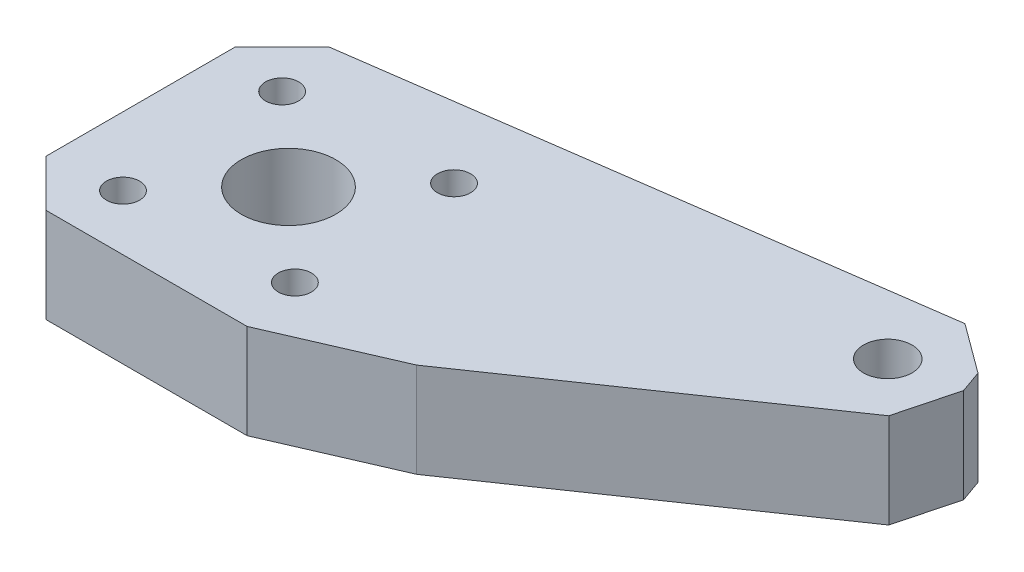
ISO-10303-21;
HEADER;
FILE_DESCRIPTION(('STEP AP214'),'2;1');
FILE_NAME('part.step','',(''),(''),'','','');
FILE_SCHEMA(('AUTOMOTIVE_DESIGN { 1 0 10303 214 1 1 1 1 }'));
ENDSEC;
DATA;
#1=APPLICATION_CONTEXT('core data for automotive mechanical design processes');
#2=APPLICATION_PROTOCOL_DEFINITION('international standard','automotive_design',2000,#1);
#3=PRODUCT_CONTEXT('',#1,'mechanical');
#4=PRODUCT('Part','Part','',(#3));
#5=PRODUCT_RELATED_PRODUCT_CATEGORY('part','',(#4));
#6=PRODUCT_DEFINITION_FORMATION('','',#4);
#7=PRODUCT_DEFINITION_CONTEXT('part definition',#1,'design');
#8=PRODUCT_DEFINITION('design','',#6,#7);
#9=PRODUCT_DEFINITION_SHAPE('','',#8);
#10=(LENGTH_UNIT() NAMED_UNIT(*) SI_UNIT(.MILLI.,.METRE.));
#11=(NAMED_UNIT(*) PLANE_ANGLE_UNIT() SI_UNIT($,.RADIAN.));
#12=(NAMED_UNIT(*) SI_UNIT($,.STERADIAN.) SOLID_ANGLE_UNIT());
#13=UNCERTAINTY_MEASURE_WITH_UNIT(LENGTH_MEASURE(1.E-05),#10,'distance_accuracy_value','');
#14=(GEOMETRIC_REPRESENTATION_CONTEXT(3) GLOBAL_UNCERTAINTY_ASSIGNED_CONTEXT((#13)) GLOBAL_UNIT_ASSIGNED_CONTEXT((#10,
#11,#12)) REPRESENTATION_CONTEXT('',''));
#15=CARTESIAN_POINT('',(0.,0.,0.));
#16=DIRECTION('',(0.,0.,1.));
#17=DIRECTION('',(1.,0.,0.));
#18=AXIS2_PLACEMENT_3D('',#15,#16,#17);
#19=CARTESIAN_POINT('',(0.,8.,0.));
#20=DIRECTION('',(0.,-1.,0.));
#21=DIRECTION('',(0.,0.,-1.));
#22=AXIS2_PLACEMENT_3D('',#19,#20,#21);
#23=PLANE('',#22);
#24=DIRECTION('',(1.,0.,0.));
#25=VECTOR('',#24,1.);
#26=CARTESIAN_POINT('',(17.,8.,-1.11355369369903E-13));
#27=LINE('',#26,#25);
#28=CARTESIAN_POINT('',(0.,8.,0.));
#29=VERTEX_POINT('',#28);
#30=CARTESIAN_POINT('',(17.,8.,-1.11355369369903E-13));
#31=VERTEX_POINT('',#30);
#32=EDGE_CURVE('E163',#29,#31,#27,.T.);
#33=ORIENTED_EDGE('',*,*,#32,.T.);
#34=DIRECTION('',(0.917339441335737,0.,-0.398105952442107));
#35=VECTOR('',#34,1.);
#36=CARTESIAN_POINT('',(26.9989999105595,8.,-4.33935488161908));
#37=LINE('',#36,#35);
#38=CARTESIAN_POINT('',(26.9989999105595,8.,-4.33935488161908));
#39=VERTEX_POINT('',#38);
#40=EDGE_CURVE('E101',#31,#39,#37,.T.);
#41=ORIENTED_EDGE('',*,*,#40,.T.);
#42=DIRECTION('',(0.824523135224951,0.,-0.565828242030049));
#43=VECTOR('',#42,1.);
#44=CARTESIAN_POINT('',(50.6628138915156,8.,-20.5786254278815));
#45=LINE('',#44,#43);
#46=CARTESIAN_POINT('',(50.6628138915156,8.,-20.5786254278815));
#47=VERTEX_POINT('',#46);
#48=EDGE_CURVE('E184',#39,#47,#45,.T.);
#49=ORIENTED_EDGE('',*,*,#48,.T.);
#50=DIRECTION('',(0.253603278088408,0.,-0.967308315555497));
#51=VECTOR('',#50,1.);
#52=CARTESIAN_POINT('',(51.9764788720136,8.,-25.589282502459));
#53=LINE('',#52,#51);
#54=CARTESIAN_POINT('',(51.9764788720136,8.,-25.589282502459));
#55=VERTEX_POINT('',#54);
#56=EDGE_CURVE('E203',#47,#55,#53,.T.);
#57=ORIENTED_EDGE('',*,*,#56,.T.);
#58=DIRECTION('',(-0.333558557625138,0.,-0.942729382503292));
#59=VECTOR('',#58,1.);
#60=CARTESIAN_POINT('',(51.3093617567633,8.,-27.4747412674656));
#61=LINE('',#60,#59);
#62=CARTESIAN_POINT('',(51.3093617567633,8.,-27.4747412674656));
#63=VERTEX_POINT('',#62);
#64=EDGE_CURVE('E200',#55,#63,#61,.T.);
#65=ORIENTED_EDGE('',*,*,#64,.T.);
#66=DIRECTION('',(-0.805521560746049,0.,-0.592566464772728));
#67=VECTOR('',#66,1.);
#68=CARTESIAN_POINT('',(47.1367600720988,8.,-30.5442355549883));
#69=LINE('',#68,#67);
#70=CARTESIAN_POINT('',(47.1367600720988,8.,-30.5442355549883));
#71=VERTEX_POINT('',#70);
#72=EDGE_CURVE('E202',#63,#71,#69,.T.);
#73=ORIENTED_EDGE('',*,*,#72,.T.);
#74=DIRECTION('',(-0.990268068741571,0.,0.139173100960062));
#75=VECTOR('',#74,1.);
#76=CARTESIAN_POINT('',(0.,8.,-23.9195959492893));
#77=LINE('',#76,#75);
#78=CARTESIAN_POINT('',(0.,8.,-23.9195959492893));
#79=VERTEX_POINT('',#78);
#80=EDGE_CURVE('E126',#71,#79,#77,.T.);
#81=ORIENTED_EDGE('',*,*,#80,.T.);
#82=DIRECTION('',(-0.707106781186548,0.,0.707106781186547));
#83=VECTOR('',#82,1.);
#84=CARTESIAN_POINT('',(-3.95979797464467,8.,-19.9597979746447));
#85=LINE('',#84,#83);
#86=CARTESIAN_POINT('',(-3.95979797464467,8.,-19.9597979746447));
#87=VERTEX_POINT('',#86);
#88=EDGE_CURVE('E120',#79,#87,#85,.T.);
#89=ORIENTED_EDGE('',*,*,#88,.T.);
#90=DIRECTION('',(0.,0.,1.));
#91=VECTOR('',#90,1.);
#92=CARTESIAN_POINT('',(-3.95979797464467,8.,-3.95979797464467));
#93=LINE('',#92,#91);
#94=CARTESIAN_POINT('',(-3.95979797464467,8.,-3.95979797464467));
#95=VERTEX_POINT('',#94);
#96=EDGE_CURVE('E124',#87,#95,#93,.T.);
#97=ORIENTED_EDGE('',*,*,#96,.T.);
#98=DIRECTION('',(0.707106781186547,0.,0.707106781186548));
#99=VECTOR('',#98,1.);
#100=CARTESIAN_POINT('',(0.,8.,0.));
#101=LINE('',#100,#99);
#102=EDGE_CURVE('E52',#95,#29,#101,.T.);
#103=ORIENTED_EDGE('',*,*,#102,.T.);
#104=EDGE_LOOP('',(#33,#41,#49,#57,#65,#73,#81,#89,#97,#103));
#105=FACE_BOUND('',#104,.T.);
#106=CARTESIAN_POINT('',(8.54020202535533,8.,-11.9597979746447));
#107=DIRECTION('',(0.,1.,0.));
#108=DIRECTION('',(0.,0.,1.));
#109=AXIS2_PLACEMENT_3D('',#106,#107,#108);
#110=CIRCLE('',#109,4.);
#111=CARTESIAN_POINT('',(8.54020202535533,8.,-7.95979797464466));
#112=VERTEX_POINT('',#111);
#113=EDGE_CURVE('E148',#112,#112,#110,.T.);
#114=ORIENTED_EDGE('',*,*,#113,.F.);
#115=EDGE_LOOP('',(#114));
#116=FACE_BOUND('',#115,.T.);
#117=CARTESIAN_POINT('',(46.4579087106203,8.,-24.697439818024));
#118=DIRECTION('',(0.,1.,0.));
#119=DIRECTION('',(0.,0.,1.));
#120=AXIS2_PLACEMENT_3D('',#117,#118,#119);
#121=CIRCLE('',#120,2.04999999999999);
#122=CARTESIAN_POINT('',(46.4579087106203,8.,-22.647439818024));
#123=VERTEX_POINT('',#122);
#124=EDGE_CURVE('E214',#123,#123,#121,.T.);
#125=ORIENTED_EDGE('',*,*,#124,.F.);
#126=EDGE_LOOP('',(#125));
#127=FACE_BOUND('',#126,.T.);
#128=CARTESIAN_POINT('',(15.265245431698,8.,-19.2250434063428));
#129=DIRECTION('',(0.,1.,0.));
#130=DIRECTION('',(0.,0.,1.));
#131=AXIS2_PLACEMENT_3D('',#128,#129,#130);
#132=CIRCLE('',#131,1.4);
#133=CARTESIAN_POINT('',(15.265245431698,8.,-17.8250434063428));
#134=VERTEX_POINT('',#133);
#135=EDGE_CURVE('E220',#134,#134,#132,.T.);
#136=ORIENTED_EDGE('',*,*,#135,.F.);
#137=EDGE_LOOP('',(#136));
#138=FACE_BOUND('',#137,.T.);
#139=CARTESIAN_POINT('',(1.27495659365739,8.,-18.6848413809873));
#140=DIRECTION('',(0.,1.,0.));
#141=DIRECTION('',(0.,0.,1.));
#142=AXIS2_PLACEMENT_3D('',#139,#140,#141);
#143=CIRCLE('',#142,1.4);
#144=CARTESIAN_POINT('',(1.27495659365739,8.,-17.2848413809873));
#145=VERTEX_POINT('',#144);
#146=EDGE_CURVE('E226',#145,#145,#143,.T.);
#147=ORIENTED_EDGE('',*,*,#146,.F.);
#148=EDGE_LOOP('',(#147));
#149=FACE_BOUND('',#148,.T.);
#150=CARTESIAN_POINT('',(15.8054474570534,8.,-5.2347545683022));
#151=DIRECTION('',(0.,1.,0.));
#152=DIRECTION('',(0.,0.,1.));
#153=AXIS2_PLACEMENT_3D('',#150,#151,#152);
#154=CIRCLE('',#153,1.4);
#155=CARTESIAN_POINT('',(15.8054474570534,8.,-3.8347545683022));
#156=VERTEX_POINT('',#155);
#157=EDGE_CURVE('E232',#156,#156,#154,.T.);
#158=ORIENTED_EDGE('',*,*,#157,.F.);
#159=EDGE_LOOP('',(#158));
#160=FACE_BOUND('',#159,.T.);
#161=CARTESIAN_POINT('',(1.81515861901283,8.,-4.69455254294679));
#162=DIRECTION('',(0.,1.,0.));
#163=DIRECTION('',(0.,0.,1.));
#164=AXIS2_PLACEMENT_3D('',#161,#162,#163);
#165=CIRCLE('',#164,1.4);
#166=CARTESIAN_POINT('',(1.81515861901283,8.,-3.29455254294679));
#167=VERTEX_POINT('',#166);
#168=EDGE_CURVE('E238',#167,#167,#165,.T.);
#169=ORIENTED_EDGE('',*,*,#168,.F.);
#170=EDGE_LOOP('',(#169));
#171=FACE_BOUND('',#170,.T.);
#172=ADVANCED_FACE('F35',(#105,#116,#127,#138,#149,#160,#171),#23,.F.);
#173=CARTESIAN_POINT('',(0.,0.,0.));
#174=DIRECTION('',(0.,-1.,0.));
#175=DIRECTION('',(0.,0.,-1.));
#176=AXIS2_PLACEMENT_3D('',#173,#174,#175);
#177=PLANE('',#176);
#178=CARTESIAN_POINT('',(15.8054474570534,0.,-5.2347545683022));
#179=DIRECTION('',(0.,1.,0.));
#180=DIRECTION('',(0.,0.,1.));
#181=AXIS2_PLACEMENT_3D('',#178,#179,#180);
#182=CIRCLE('',#181,1.4);
#183=CARTESIAN_POINT('',(15.8054474570534,0.,-3.8347545683022));
#184=VERTEX_POINT('',#183);
#185=EDGE_CURVE('E235',#184,#184,#182,.T.);
#186=ORIENTED_EDGE('',*,*,#185,.T.);
#187=EDGE_LOOP('',(#186));
#188=FACE_BOUND('',#187,.T.);
#189=CARTESIAN_POINT('',(15.265245431698,0.,-19.2250434063428));
#190=DIRECTION('',(0.,1.,0.));
#191=DIRECTION('',(0.,0.,1.));
#192=AXIS2_PLACEMENT_3D('',#189,#190,#191);
#193=CIRCLE('',#192,1.4);
#194=CARTESIAN_POINT('',(15.265245431698,0.,-17.8250434063428));
#195=VERTEX_POINT('',#194);
#196=EDGE_CURVE('E223',#195,#195,#193,.T.);
#197=ORIENTED_EDGE('',*,*,#196,.T.);
#198=EDGE_LOOP('',(#197));
#199=FACE_BOUND('',#198,.T.);
#200=CARTESIAN_POINT('',(8.54020202535533,0.,-11.9597979746447));
#201=DIRECTION('',(0.,1.,0.));
#202=DIRECTION('',(0.,0.,1.));
#203=AXIS2_PLACEMENT_3D('',#200,#201,#202);
#204=CIRCLE('',#203,4.);
#205=CARTESIAN_POINT('',(8.54020202535533,0.,-7.95979797464466));
#206=VERTEX_POINT('',#205);
#207=EDGE_CURVE('E211',#206,#206,#204,.T.);
#208=ORIENTED_EDGE('',*,*,#207,.T.);
#209=EDGE_LOOP('',(#208));
#210=FACE_BOUND('',#209,.T.);
#211=DIRECTION('',(1.,0.,0.));
#212=VECTOR('',#211,1.);
#213=CARTESIAN_POINT('',(17.,0.,-1.11355369369903E-13));
#214=LINE('',#213,#212);
#215=CARTESIAN_POINT('',(0.,0.,0.));
#216=VERTEX_POINT('',#215);
#217=CARTESIAN_POINT('',(17.,0.,-1.11355369369903E-13));
#218=VERTEX_POINT('',#217);
#219=EDGE_CURVE('E144',#216,#218,#214,.T.);
#220=ORIENTED_EDGE('',*,*,#219,.F.);
#221=DIRECTION('',(0.707106781186547,0.,0.707106781186548));
#222=VECTOR('',#221,1.);
#223=CARTESIAN_POINT('',(0.,0.,0.));
#224=LINE('',#223,#222);
#225=CARTESIAN_POINT('',(-3.95979797464467,0.,-3.95979797464467));
#226=VERTEX_POINT('',#225);
#227=EDGE_CURVE('E93',#226,#216,#224,.T.);
#228=ORIENTED_EDGE('',*,*,#227,.F.);
#229=DIRECTION('',(0.,0.,1.));
#230=VECTOR('',#229,1.);
#231=CARTESIAN_POINT('',(-3.95979797464467,0.,-3.95979797464467));
#232=LINE('',#231,#230);
#233=CARTESIAN_POINT('',(-3.95979797464467,0.,-19.9597979746447));
#234=VERTEX_POINT('',#233);
#235=EDGE_CURVE('E87',#234,#226,#232,.T.);
#236=ORIENTED_EDGE('',*,*,#235,.F.);
#237=DIRECTION('',(-0.707106781186548,0.,0.707106781186547));
#238=VECTOR('',#237,1.);
#239=CARTESIAN_POINT('',(-3.95979797464467,0.,-19.9597979746447));
#240=LINE('',#239,#238);
#241=CARTESIAN_POINT('',(0.,0.,-23.9195959492893));
#242=VERTEX_POINT('',#241);
#243=EDGE_CURVE('E134',#242,#234,#240,.T.);
#244=ORIENTED_EDGE('',*,*,#243,.F.);
#245=DIRECTION('',(-0.990268068741571,0.,0.139173100960062));
#246=VECTOR('',#245,1.);
#247=CARTESIAN_POINT('',(0.,0.,-23.9195959492893));
#248=LINE('',#247,#246);
#249=CARTESIAN_POINT('',(47.1367600720988,0.,-30.5442355549883));
#250=VERTEX_POINT('',#249);
#251=EDGE_CURVE('E158',#250,#242,#248,.T.);
#252=ORIENTED_EDGE('',*,*,#251,.F.);
#253=DIRECTION('',(-0.805521560746049,0.,-0.592566464772728));
#254=VECTOR('',#253,1.);
#255=CARTESIAN_POINT('',(47.1367600720988,0.,-30.5442355549883));
#256=LINE('',#255,#254);
#257=CARTESIAN_POINT('',(51.3093617567633,0.,-27.4747412674656));
#258=VERTEX_POINT('',#257);
#259=EDGE_CURVE('E156',#258,#250,#256,.T.);
#260=ORIENTED_EDGE('',*,*,#259,.F.);
#261=DIRECTION('',(-0.333558557625138,0.,-0.942729382503292));
#262=VECTOR('',#261,1.);
#263=CARTESIAN_POINT('',(51.3093617567633,0.,-27.4747412674656));
#264=LINE('',#263,#262);
#265=CARTESIAN_POINT('',(51.9764788720136,0.,-25.589282502459));
#266=VERTEX_POINT('',#265);
#267=EDGE_CURVE('E154',#266,#258,#264,.T.);
#268=ORIENTED_EDGE('',*,*,#267,.F.);
#269=DIRECTION('',(0.253603278088408,0.,-0.967308315555497));
#270=VECTOR('',#269,1.);
#271=CARTESIAN_POINT('',(51.9764788720136,0.,-25.589282502459));
#272=LINE('',#271,#270);
#273=CARTESIAN_POINT('',(50.6628138915156,0.,-20.5786254278815));
#274=VERTEX_POINT('',#273);
#275=EDGE_CURVE('E152',#274,#266,#272,.T.);
#276=ORIENTED_EDGE('',*,*,#275,.F.);
#277=DIRECTION('',(0.824523135224951,0.,-0.565828242030049));
#278=VECTOR('',#277,1.);
#279=CARTESIAN_POINT('',(50.6628138915156,0.,-20.5786254278815));
#280=LINE('',#279,#278);
#281=CARTESIAN_POINT('',(26.9989999105595,0.,-4.33935488161908));
#282=VERTEX_POINT('',#281);
#283=EDGE_CURVE('E150',#282,#274,#280,.T.);
#284=ORIENTED_EDGE('',*,*,#283,.F.);
#285=DIRECTION('',(0.917339441335737,0.,-0.398105952442107));
#286=VECTOR('',#285,1.);
#287=CARTESIAN_POINT('',(26.9989999105595,0.,-4.33935488161908));
#288=LINE('',#287,#286);
#289=EDGE_CURVE('E147',#218,#282,#288,.T.);
#290=ORIENTED_EDGE('',*,*,#289,.F.);
#291=EDGE_LOOP('',(#220,#228,#236,#244,#252,#260,#268,#276,#284,#290));
#292=FACE_BOUND('',#291,.T.);
#293=CARTESIAN_POINT('',(46.4579087106203,0.,-24.697439818024));
#294=DIRECTION('',(0.,1.,0.));
#295=DIRECTION('',(0.,0.,1.));
#296=AXIS2_PLACEMENT_3D('',#293,#294,#295);
#297=CIRCLE('',#296,2.04999999999999);
#298=CARTESIAN_POINT('',(46.4579087106203,0.,-22.647439818024));
#299=VERTEX_POINT('',#298);
#300=EDGE_CURVE('E217',#299,#299,#297,.T.);
#301=ORIENTED_EDGE('',*,*,#300,.T.);
#302=EDGE_LOOP('',(#301));
#303=FACE_BOUND('',#302,.T.);
#304=CARTESIAN_POINT('',(1.27495659365739,0.,-18.6848413809873));
#305=DIRECTION('',(0.,1.,0.));
#306=DIRECTION('',(0.,0.,1.));
#307=AXIS2_PLACEMENT_3D('',#304,#305,#306);
#308=CIRCLE('',#307,1.4);
#309=CARTESIAN_POINT('',(1.27495659365739,0.,-17.2848413809873));
#310=VERTEX_POINT('',#309);
#311=EDGE_CURVE('E229',#310,#310,#308,.T.);
#312=ORIENTED_EDGE('',*,*,#311,.T.);
#313=EDGE_LOOP('',(#312));
#314=FACE_BOUND('',#313,.T.);
#315=CARTESIAN_POINT('',(1.81515861901283,0.,-4.69455254294679));
#316=DIRECTION('',(0.,1.,0.));
#317=DIRECTION('',(0.,0.,1.));
#318=AXIS2_PLACEMENT_3D('',#315,#316,#317);
#319=CIRCLE('',#318,1.4);
#320=CARTESIAN_POINT('',(1.81515861901283,0.,-3.29455254294679));
#321=VERTEX_POINT('',#320);
#322=EDGE_CURVE('E241',#321,#321,#319,.T.);
#323=ORIENTED_EDGE('',*,*,#322,.T.);
#324=EDGE_LOOP('',(#323));
#325=FACE_BOUND('',#324,.T.);
#326=ADVANCED_FACE('F188',(#188,#199,#210,#292,#303,#314,#325),#177,.T.);
#327=CARTESIAN_POINT('',(17.,8.,-1.11355369369903E-13));
#328=DIRECTION('',(0.,0.,-1.));
#329=DIRECTION('',(-1.,0.,0.));
#330=AXIS2_PLACEMENT_3D('',#327,#328,#329);
#331=PLANE('',#330);
#332=ORIENTED_EDGE('',*,*,#219,.T.);
#333=DIRECTION('',(0.,-1.,0.));
#334=VECTOR('',#333,1.);
#335=CARTESIAN_POINT('',(17.,8.,-1.11355369369903E-13));
#336=LINE('',#335,#334);
#337=EDGE_CURVE('E11',#31,#218,#336,.T.);
#338=ORIENTED_EDGE('',*,*,#337,.F.);
#339=ORIENTED_EDGE('',*,*,#32,.F.);
#340=DIRECTION('',(0.,-1.,0.));
#341=VECTOR('',#340,1.);
#342=CARTESIAN_POINT('',(0.,8.,0.));
#343=LINE('',#342,#341);
#344=EDGE_CURVE('E140',#29,#216,#343,.T.);
#345=ORIENTED_EDGE('',*,*,#344,.T.);
#346=EDGE_LOOP('',(#332,#338,#339,#345));
#347=FACE_BOUND('',#346,.T.);
#348=ADVANCED_FACE('F37',(#347),#331,.F.);
#349=CARTESIAN_POINT('',(26.9989999105595,8.,-4.33935488161908));
#350=DIRECTION('',(-0.398105952442107,0.,-0.917339441335737));
#351=DIRECTION('',(-0.917339441335737,0.,0.398105952442107));
#352=AXIS2_PLACEMENT_3D('',#349,#350,#351);
#353=PLANE('',#352);
#354=ORIENTED_EDGE('',*,*,#289,.T.);
#355=DIRECTION('',(0.,-1.,0.));
#356=VECTOR('',#355,1.);
#357=CARTESIAN_POINT('',(26.9989999105595,8.,-4.33935488161908));
#358=LINE('',#357,#356);
#359=EDGE_CURVE('E44',#39,#282,#358,.T.);
#360=ORIENTED_EDGE('',*,*,#359,.F.);
#361=ORIENTED_EDGE('',*,*,#40,.F.);
#362=ORIENTED_EDGE('',*,*,#337,.T.);
#363=EDGE_LOOP('',(#354,#360,#361,#362));
#364=FACE_BOUND('',#363,.T.);
#365=ADVANCED_FACE('F281',(#364),#353,.F.);
#366=CARTESIAN_POINT('',(50.6628138915156,8.,-20.5786254278815));
#367=DIRECTION('',(-0.56582824203005,0.,-0.824523135224952));
#368=DIRECTION('',(-0.824523135224952,0.,0.56582824203005));
#369=AXIS2_PLACEMENT_3D('',#366,#367,#368);
#370=PLANE('',#369);
#371=ORIENTED_EDGE('',*,*,#283,.T.);
#372=DIRECTION('',(0.,-1.,0.));
#373=VECTOR('',#372,1.);
#374=CARTESIAN_POINT('',(50.6628138915156,8.,-20.5786254278815));
#375=LINE('',#374,#373);
#376=EDGE_CURVE('E176',#47,#274,#375,.T.);
#377=ORIENTED_EDGE('',*,*,#376,.F.);
#378=ORIENTED_EDGE('',*,*,#48,.F.);
#379=ORIENTED_EDGE('',*,*,#359,.T.);
#380=EDGE_LOOP('',(#371,#377,#378,#379));
#381=FACE_BOUND('',#380,.T.);
#382=ADVANCED_FACE('F182',(#381),#370,.F.);
#383=CARTESIAN_POINT('',(51.9764788720136,8.,-25.589282502459));
#384=DIRECTION('',(-0.967308315555497,0.,-0.253603278088408));
#385=DIRECTION('',(-0.253603278088408,0.,0.967308315555497));
#386=AXIS2_PLACEMENT_3D('',#383,#384,#385);
#387=PLANE('',#386);
#388=ORIENTED_EDGE('',*,*,#275,.T.);
#389=DIRECTION('',(0.,-1.,0.));
#390=VECTOR('',#389,1.);
#391=CARTESIAN_POINT('',(51.9764788720136,8.,-25.589282502459));
#392=LINE('',#391,#390);
#393=EDGE_CURVE('E173',#55,#266,#392,.T.);
#394=ORIENTED_EDGE('',*,*,#393,.F.);
#395=ORIENTED_EDGE('',*,*,#56,.F.);
#396=ORIENTED_EDGE('',*,*,#376,.T.);
#397=EDGE_LOOP('',(#388,#394,#395,#396));
#398=FACE_BOUND('',#397,.T.);
#399=ADVANCED_FACE('F194',(#398),#387,.F.);
#400=CARTESIAN_POINT('',(51.3093617567633,8.,-27.4747412674656));
#401=DIRECTION('',(-0.942729382503291,0.,0.333558557625138));
#402=DIRECTION('',(0.333558557625138,0.,0.942729382503292));
#403=AXIS2_PLACEMENT_3D('',#400,#401,#402);
#404=PLANE('',#403);
#405=ORIENTED_EDGE('',*,*,#267,.T.);
#406=DIRECTION('',(0.,-1.,0.));
#407=VECTOR('',#406,1.);
#408=CARTESIAN_POINT('',(51.3093617567633,8.,-27.4747412674656));
#409=LINE('',#408,#407);
#410=EDGE_CURVE('E170',#63,#258,#409,.T.);
#411=ORIENTED_EDGE('',*,*,#410,.F.);
#412=ORIENTED_EDGE('',*,*,#64,.F.);
#413=ORIENTED_EDGE('',*,*,#393,.T.);
#414=EDGE_LOOP('',(#405,#411,#412,#413));
#415=FACE_BOUND('',#414,.T.);
#416=ADVANCED_FACE('F198',(#415),#404,.F.);
#417=CARTESIAN_POINT('',(47.1367600720988,8.,-30.5442355549883));
#418=DIRECTION('',(-0.592566464772728,0.,0.80552156074605));
#419=DIRECTION('',(0.80552156074605,0.,0.592566464772728));
#420=AXIS2_PLACEMENT_3D('',#417,#418,#419);
#421=PLANE('',#420);
#422=ORIENTED_EDGE('',*,*,#259,.T.);
#423=DIRECTION('',(0.,-1.,0.));
#424=VECTOR('',#423,1.);
#425=CARTESIAN_POINT('',(47.1367600720988,8.,-30.5442355549883));
#426=LINE('',#425,#424);
#427=EDGE_CURVE('E167',#71,#250,#426,.T.);
#428=ORIENTED_EDGE('',*,*,#427,.F.);
#429=ORIENTED_EDGE('',*,*,#72,.F.);
#430=ORIENTED_EDGE('',*,*,#410,.T.);
#431=EDGE_LOOP('',(#422,#428,#429,#430));
#432=FACE_BOUND('',#431,.T.);
#433=ADVANCED_FACE('F271',(#432),#421,.F.);
#434=CARTESIAN_POINT('',(0.,8.,-23.9195959492893));
#435=DIRECTION('',(0.139173100960062,0.,0.990268068741571));
#436=DIRECTION('',(0.990268068741571,0.,-0.139173100960062));
#437=AXIS2_PLACEMENT_3D('',#434,#435,#436);
#438=PLANE('',#437);
#439=ORIENTED_EDGE('',*,*,#251,.T.);
#440=DIRECTION('',(0.,-1.,0.));
#441=VECTOR('',#440,1.);
#442=CARTESIAN_POINT('',(0.,8.,-23.9195959492893));
#443=LINE('',#442,#441);
#444=EDGE_CURVE('E135',#79,#242,#443,.T.);
#445=ORIENTED_EDGE('',*,*,#444,.F.);
#446=ORIENTED_EDGE('',*,*,#80,.F.);
#447=ORIENTED_EDGE('',*,*,#427,.T.);
#448=EDGE_LOOP('',(#439,#445,#446,#447));
#449=FACE_BOUND('',#448,.T.);
#450=ADVANCED_FACE('F268',(#449),#438,.F.);
#451=CARTESIAN_POINT('',(-3.95979797464467,8.,-19.9597979746447));
#452=DIRECTION('',(0.707106781186547,0.,0.707106781186548));
#453=DIRECTION('',(0.707106781186548,0.,-0.707106781186547));
#454=AXIS2_PLACEMENT_3D('',#451,#452,#453);
#455=PLANE('',#454);
#456=ORIENTED_EDGE('',*,*,#243,.T.);
#457=DIRECTION('',(0.,-1.,0.));
#458=VECTOR('',#457,1.);
#459=CARTESIAN_POINT('',(-3.95979797464467,8.,-19.9597979746447));
#460=LINE('',#459,#458);
#461=EDGE_CURVE('E131',#87,#234,#460,.T.);
#462=ORIENTED_EDGE('',*,*,#461,.F.);
#463=ORIENTED_EDGE('',*,*,#88,.F.);
#464=ORIENTED_EDGE('',*,*,#444,.T.);
#465=EDGE_LOOP('',(#456,#462,#463,#464));
#466=FACE_BOUND('',#465,.T.);
#467=ADVANCED_FACE('F132',(#466),#455,.F.);
#468=CARTESIAN_POINT('',(-3.95979797464467,8.,-3.95979797464467));
#469=DIRECTION('',(1.,0.,0.));
#470=DIRECTION('',(0.,0.,-1.));
#471=AXIS2_PLACEMENT_3D('',#468,#469,#470);
#472=PLANE('',#471);
#473=ORIENTED_EDGE('',*,*,#235,.T.);
#474=DIRECTION('',(0.,-1.,0.));
#475=VECTOR('',#474,1.);
#476=CARTESIAN_POINT('',(-3.95979797464467,8.,-3.95979797464467));
#477=LINE('',#476,#475);
#478=EDGE_CURVE('E136',#95,#226,#477,.T.);
#479=ORIENTED_EDGE('',*,*,#478,.F.);
#480=ORIENTED_EDGE('',*,*,#96,.F.);
#481=ORIENTED_EDGE('',*,*,#461,.T.);
#482=EDGE_LOOP('',(#473,#479,#480,#481));
#483=FACE_BOUND('',#482,.T.);
#484=ADVANCED_FACE('F138',(#483),#472,.F.);
#485=CARTESIAN_POINT('',(0.,8.,0.));
#486=DIRECTION('',(0.707106781186548,0.,-0.707106781186547));
#487=DIRECTION('',(-0.707106781186547,0.,-0.707106781186548));
#488=AXIS2_PLACEMENT_3D('',#485,#486,#487);
#489=PLANE('',#488);
#490=ORIENTED_EDGE('',*,*,#227,.T.);
#491=ORIENTED_EDGE('',*,*,#344,.F.);
#492=ORIENTED_EDGE('',*,*,#102,.F.);
#493=ORIENTED_EDGE('',*,*,#478,.T.);
#494=EDGE_LOOP('',(#490,#491,#492,#493));
#495=FACE_BOUND('',#494,.T.);
#496=ADVANCED_FACE('F261',(#495),#489,.F.);
#497=CARTESIAN_POINT('',(8.54020202535533,8.,-11.9597979746447));
#498=DIRECTION('',(0.,-1.,0.));
#499=DIRECTION('',(0.,0.,-1.));
#500=AXIS2_PLACEMENT_3D('',#497,#498,#499);
#501=CYLINDRICAL_SURFACE('',#500,4.);
#502=ORIENTED_EDGE('',*,*,#113,.T.);
#503=EDGE_LOOP('',(#502));
#504=FACE_BOUND('',#503,.T.);
#505=ORIENTED_EDGE('',*,*,#207,.F.);
#506=EDGE_LOOP('',(#505));
#507=FACE_BOUND('',#506,.T.);
#508=ADVANCED_FACE('F258',(#504,#507),#501,.F.);
#509=CARTESIAN_POINT('',(46.4579087106203,8.,-24.697439818024));
#510=DIRECTION('',(0.,-1.,0.));
#511=DIRECTION('',(0.,0.,-1.));
#512=AXIS2_PLACEMENT_3D('',#509,#510,#511);
#513=CYLINDRICAL_SURFACE('',#512,2.04999999999999);
#514=ORIENTED_EDGE('',*,*,#124,.T.);
#515=EDGE_LOOP('',(#514));
#516=FACE_BOUND('',#515,.T.);
#517=ORIENTED_EDGE('',*,*,#300,.F.);
#518=EDGE_LOOP('',(#517));
#519=FACE_BOUND('',#518,.T.);
#520=ADVANCED_FACE('F357',(#516,#519),#513,.F.);
#521=CARTESIAN_POINT('',(15.265245431698,8.,-19.2250434063428));
#522=DIRECTION('',(0.,-1.,0.));
#523=DIRECTION('',(0.,0.,-1.));
#524=AXIS2_PLACEMENT_3D('',#521,#522,#523);
#525=CYLINDRICAL_SURFACE('',#524,1.4);
#526=ORIENTED_EDGE('',*,*,#135,.T.);
#527=EDGE_LOOP('',(#526));
#528=FACE_BOUND('',#527,.T.);
#529=ORIENTED_EDGE('',*,*,#196,.F.);
#530=EDGE_LOOP('',(#529));
#531=FACE_BOUND('',#530,.T.);
#532=ADVANCED_FACE('F365',(#528,#531),#525,.F.);
#533=CARTESIAN_POINT('',(1.27495659365739,8.,-18.6848413809873));
#534=DIRECTION('',(0.,-1.,0.));
#535=DIRECTION('',(0.,0.,-1.));
#536=AXIS2_PLACEMENT_3D('',#533,#534,#535);
#537=CYLINDRICAL_SURFACE('',#536,1.4);
#538=ORIENTED_EDGE('',*,*,#146,.T.);
#539=EDGE_LOOP('',(#538));
#540=FACE_BOUND('',#539,.T.);
#541=ORIENTED_EDGE('',*,*,#311,.F.);
#542=EDGE_LOOP('',(#541));
#543=FACE_BOUND('',#542,.T.);
#544=ADVANCED_FACE('F373',(#540,#543),#537,.F.);
#545=CARTESIAN_POINT('',(15.8054474570534,8.,-5.2347545683022));
#546=DIRECTION('',(0.,-1.,0.));
#547=DIRECTION('',(0.,0.,-1.));
#548=AXIS2_PLACEMENT_3D('',#545,#546,#547);
#549=CYLINDRICAL_SURFACE('',#548,1.4);
#550=ORIENTED_EDGE('',*,*,#157,.T.);
#551=EDGE_LOOP('',(#550));
#552=FACE_BOUND('',#551,.T.);
#553=ORIENTED_EDGE('',*,*,#185,.F.);
#554=EDGE_LOOP('',(#553));
#555=FACE_BOUND('',#554,.T.);
#556=ADVANCED_FACE('F382',(#552,#555),#549,.F.);
#557=CARTESIAN_POINT('',(1.81515861901283,8.,-4.69455254294679));
#558=DIRECTION('',(0.,-1.,0.));
#559=DIRECTION('',(0.,0.,-1.));
#560=AXIS2_PLACEMENT_3D('',#557,#558,#559);
#561=CYLINDRICAL_SURFACE('',#560,1.4);
#562=ORIENTED_EDGE('',*,*,#168,.T.);
#563=EDGE_LOOP('',(#562));
#564=FACE_BOUND('',#563,.T.);
#565=ORIENTED_EDGE('',*,*,#322,.F.);
#566=EDGE_LOOP('',(#565));
#567=FACE_BOUND('',#566,.T.);
#568=ADVANCED_FACE('F247',(#564,#567),#561,.F.);
#569=CLOSED_SHELL('',(#172,#326,#348,#365,#382,#399,#416,#433,#450,#467,#484,#496,#508,#520,
#532,#544,#556,#568));
#570=MANIFOLD_SOLID_BREP('B2',#569);
#571=ADVANCED_BREP_SHAPE_REPRESENTATION('',(#18,#570),#14);
#572=SHAPE_DEFINITION_REPRESENTATION(#9,#571);
ENDSEC;
END-ISO-10303-21;
